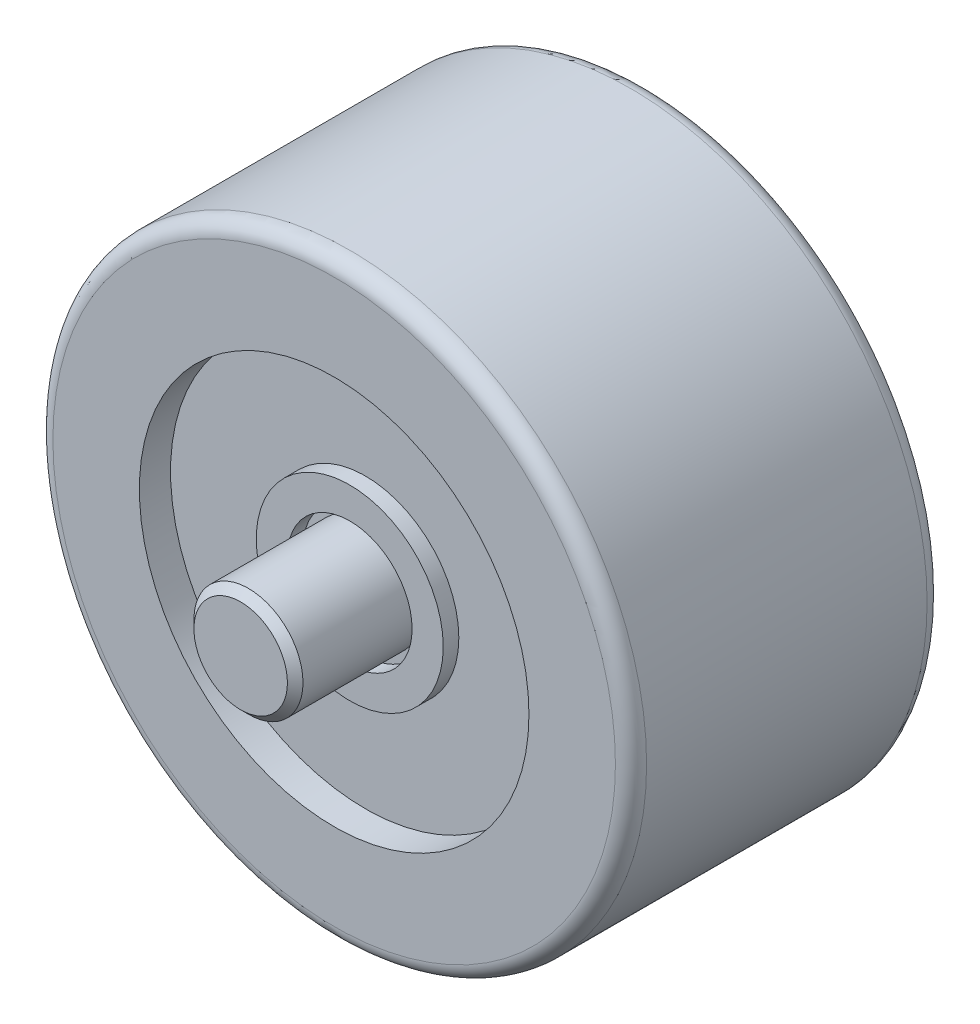
ISO-10303-21;
HEADER;
FILE_DESCRIPTION(('STEP AP214'),'2;1');
FILE_NAME('part.step','',(''),(''),'','','');
FILE_SCHEMA(('AUTOMOTIVE_DESIGN { 1 0 10303 214 1 1 1 1 }'));
ENDSEC;
DATA;
#1=APPLICATION_CONTEXT('core data for automotive mechanical design processes');
#2=APPLICATION_PROTOCOL_DEFINITION('international standard','automotive_design',2000,#1);
#3=PRODUCT_CONTEXT('',#1,'mechanical');
#4=PRODUCT('Part','Part','',(#3));
#5=PRODUCT_RELATED_PRODUCT_CATEGORY('part','',(#4));
#6=PRODUCT_DEFINITION_FORMATION('','',#4);
#7=PRODUCT_DEFINITION_CONTEXT('part definition',#1,'design');
#8=PRODUCT_DEFINITION('design','',#6,#7);
#9=PRODUCT_DEFINITION_SHAPE('','',#8);
#10=(LENGTH_UNIT() NAMED_UNIT(*) SI_UNIT(.MILLI.,.METRE.));
#11=(NAMED_UNIT(*) PLANE_ANGLE_UNIT() SI_UNIT($,.RADIAN.));
#12=(NAMED_UNIT(*) SI_UNIT($,.STERADIAN.) SOLID_ANGLE_UNIT());
#13=UNCERTAINTY_MEASURE_WITH_UNIT(LENGTH_MEASURE(1.E-05),#10,'distance_accuracy_value','');
#14=(GEOMETRIC_REPRESENTATION_CONTEXT(3) GLOBAL_UNCERTAINTY_ASSIGNED_CONTEXT((#13)) GLOBAL_UNIT_ASSIGNED_CONTEXT((#10,
#11,#12)) REPRESENTATION_CONTEXT('',''));
#15=CARTESIAN_POINT('',(0.,0.,0.));
#16=DIRECTION('',(0.,0.,1.));
#17=DIRECTION('',(1.,0.,0.));
#18=AXIS2_PLACEMENT_3D('',#15,#16,#17);
#19=CARTESIAN_POINT('',(0.,0.,8.));
#20=DIRECTION('',(0.,0.,1.));
#21=DIRECTION('',(1.,0.,0.));
#22=AXIS2_PLACEMENT_3D('',#19,#20,#21);
#23=PLANE('',#22);
#24=CARTESIAN_POINT('',(0.,0.,8.));
#25=DIRECTION('',(0.,0.,1.));
#26=DIRECTION('',(1.,0.,0.));
#27=AXIS2_PLACEMENT_3D('',#24,#25,#26);
#28=CIRCLE('',#27,4.);
#29=CARTESIAN_POINT('',(4.,0.,8.));
#30=VERTEX_POINT('',#29);
#31=EDGE_CURVE('E79',#30,#30,#28,.F.);
#32=ORIENTED_EDGE('',*,*,#31,.F.);
#33=EDGE_LOOP('',(#32));
#34=FACE_BOUND('',#33,.T.);
#35=CARTESIAN_POINT('',(0.,0.,8.));
#36=DIRECTION('',(0.,0.,1.));
#37=DIRECTION('',(1.,0.,0.));
#38=AXIS2_PLACEMENT_3D('',#35,#36,#37);
#39=CIRCLE('',#38,3.5);
#40=CARTESIAN_POINT('',(3.5,0.,8.));
#41=VERTEX_POINT('',#40);
#42=EDGE_CURVE('E137',#41,#41,#39,.T.);
#43=ORIENTED_EDGE('',*,*,#42,.F.);
#44=EDGE_LOOP('',(#43));
#45=FACE_BOUND('',#44,.T.);
#46=ADVANCED_FACE('F50',(#34,#45),#23,.T.);
#47=CARTESIAN_POINT('',(0.,0.,8.));
#48=DIRECTION('',(0.,0.,1.));
#49=DIRECTION('',(1.,0.,0.));
#50=AXIS2_PLACEMENT_3D('',#47,#48,#49);
#51=CIRCLE('',#50,12.5);
#52=CARTESIAN_POINT('',(12.5,0.,8.));
#53=VERTEX_POINT('',#52);
#54=EDGE_CURVE('E97',#53,#53,#51,.T.);
#55=ORIENTED_EDGE('',*,*,#54,.T.);
#56=EDGE_LOOP('',(#55));
#57=FACE_BOUND('',#56,.T.);
#58=CARTESIAN_POINT('',(0.,0.,8.));
#59=DIRECTION('',(0.,0.,1.));
#60=DIRECTION('',(1.,0.,0.));
#61=AXIS2_PLACEMENT_3D('',#58,#59,#60);
#62=CIRCLE('',#61,6.);
#63=CARTESIAN_POINT('',(6.,0.,8.));
#64=VERTEX_POINT('',#63);
#65=EDGE_CURVE('E118',#64,#64,#62,.T.);
#66=ORIENTED_EDGE('',*,*,#65,.F.);
#67=EDGE_LOOP('',(#66));
#68=FACE_BOUND('',#67,.T.);
#69=ADVANCED_FACE('F150',(#57,#68),#23,.T.);
#70=CARTESIAN_POINT('',(0.,0.,-10.));
#71=DIRECTION('',(0.,0.,1.));
#72=DIRECTION('',(1.,0.,0.));
#73=AXIS2_PLACEMENT_3D('',#70,#71,#72);
#74=CYLINDRICAL_SURFACE('',#73,19.05);
#75=CARTESIAN_POINT('',(0.,0.,-9.));
#76=DIRECTION('',(0.,0.,1.));
#77=DIRECTION('',(1.,0.,0.));
#78=AXIS2_PLACEMENT_3D('',#75,#76,#77);
#79=CIRCLE('',#78,19.05);
#80=CARTESIAN_POINT('',(19.05,0.,-9.));
#81=VERTEX_POINT('',#80);
#82=EDGE_CURVE('E93',#81,#81,#79,.T.);
#83=ORIENTED_EDGE('',*,*,#82,.T.);
#84=EDGE_LOOP('',(#83));
#85=FACE_BOUND('',#84,.T.);
#86=CARTESIAN_POINT('',(0.,0.,9.));
#87=DIRECTION('',(0.,0.,1.));
#88=DIRECTION('',(1.,0.,0.));
#89=AXIS2_PLACEMENT_3D('',#86,#87,#88);
#90=CIRCLE('',#89,19.05);
#91=CARTESIAN_POINT('',(19.05,0.,9.));
#92=VERTEX_POINT('',#91);
#93=EDGE_CURVE('E92',#92,#92,#90,.F.);
#94=ORIENTED_EDGE('',*,*,#93,.T.);
#95=EDGE_LOOP('',(#94));
#96=FACE_BOUND('',#95,.T.);
#97=ADVANCED_FACE('F154',(#85,#96),#74,.T.);
#98=CARTESIAN_POINT('',(0.,0.,-10.));
#99=DIRECTION('',(0.,0.,1.));
#100=DIRECTION('',(1.,0.,0.));
#101=AXIS2_PLACEMENT_3D('',#98,#99,#100);
#102=PLANE('',#101);
#103=CARTESIAN_POINT('',(0.,0.,-10.));
#104=DIRECTION('',(0.,0.,-1.));
#105=DIRECTION('',(-1.,0.,0.));
#106=AXIS2_PLACEMENT_3D('',#103,#104,#105);
#107=CIRCLE('',#106,12.5);
#108=CARTESIAN_POINT('',(-12.5,0.,-10.));
#109=VERTEX_POINT('',#108);
#110=EDGE_CURVE('E107',#109,#109,#107,.T.);
#111=ORIENTED_EDGE('',*,*,#110,.F.);
#112=EDGE_LOOP('',(#111));
#113=FACE_BOUND('',#112,.T.);
#114=CARTESIAN_POINT('',(0.,0.,-10.));
#115=DIRECTION('',(0.,0.,1.));
#116=DIRECTION('',(1.,0.,0.));
#117=AXIS2_PLACEMENT_3D('',#114,#115,#116);
#118=CIRCLE('',#117,18.05);
#119=CARTESIAN_POINT('',(18.05,0.,-10.));
#120=VERTEX_POINT('',#119);
#121=EDGE_CURVE('E87',#120,#120,#118,.F.);
#122=ORIENTED_EDGE('',*,*,#121,.T.);
#123=EDGE_LOOP('',(#122));
#124=FACE_BOUND('',#123,.T.);
#125=ADVANCED_FACE('F173',(#113,#124),#102,.F.);
#126=CARTESIAN_POINT('',(0.,0.,10.));
#127=DIRECTION('',(0.,0.,1.));
#128=DIRECTION('',(1.,0.,0.));
#129=AXIS2_PLACEMENT_3D('',#126,#127,#128);
#130=PLANE('',#129);
#131=CARTESIAN_POINT('',(0.,0.,10.));
#132=DIRECTION('',(0.,0.,1.));
#133=DIRECTION('',(1.,0.,0.));
#134=AXIS2_PLACEMENT_3D('',#131,#132,#133);
#135=CIRCLE('',#134,12.5);
#136=CARTESIAN_POINT('',(12.5,0.,10.));
#137=VERTEX_POINT('',#136);
#138=EDGE_CURVE('E99',#137,#137,#135,.T.);
#139=ORIENTED_EDGE('',*,*,#138,.F.);
#140=EDGE_LOOP('',(#139));
#141=FACE_BOUND('',#140,.T.);
#142=CARTESIAN_POINT('',(0.,0.,10.));
#143=DIRECTION('',(0.,0.,1.));
#144=DIRECTION('',(1.,0.,0.));
#145=AXIS2_PLACEMENT_3D('',#142,#143,#144);
#146=CIRCLE('',#145,18.05);
#147=CARTESIAN_POINT('',(18.05,0.,10.));
#148=VERTEX_POINT('',#147);
#149=EDGE_CURVE('E83',#148,#148,#146,.T.);
#150=ORIENTED_EDGE('',*,*,#149,.T.);
#151=EDGE_LOOP('',(#150));
#152=FACE_BOUND('',#151,.T.);
#153=ADVANCED_FACE('F170',(#141,#152),#130,.T.);
#154=CARTESIAN_POINT('',(0.,0.,-9.));
#155=DIRECTION('',(0.,0.,1.));
#156=DIRECTION('',(1.,0.,0.));
#157=AXIS2_PLACEMENT_3D('',#154,#155,#156);
#158=TOROIDAL_SURFACE('',#157,18.05,1.);
#159=ORIENTED_EDGE('',*,*,#121,.F.);
#160=EDGE_LOOP('',(#159));
#161=FACE_BOUND('',#160,.T.);
#162=ORIENTED_EDGE('',*,*,#82,.F.);
#163=EDGE_LOOP('',(#162));
#164=FACE_BOUND('',#163,.T.);
#165=ADVANCED_FACE('F168',(#161,#164),#158,.T.);
#166=CARTESIAN_POINT('',(0.,0.,9.));
#167=DIRECTION('',(0.,0.,1.));
#168=DIRECTION('',(1.,0.,0.));
#169=AXIS2_PLACEMENT_3D('',#166,#167,#168);
#170=TOROIDAL_SURFACE('',#169,18.05,1.);
#171=ORIENTED_EDGE('',*,*,#93,.F.);
#172=EDGE_LOOP('',(#171));
#173=FACE_BOUND('',#172,.T.);
#174=ORIENTED_EDGE('',*,*,#149,.F.);
#175=EDGE_LOOP('',(#174));
#176=FACE_BOUND('',#175,.T.);
#177=ADVANCED_FACE('F164',(#173,#176),#170,.T.);
#178=CARTESIAN_POINT('',(0.,0.,8.));
#179=DIRECTION('',(0.,0.,1.));
#180=DIRECTION('',(1.,0.,0.));
#181=AXIS2_PLACEMENT_3D('',#178,#179,#180);
#182=CYLINDRICAL_SURFACE('',#181,12.5);
#183=ORIENTED_EDGE('',*,*,#54,.F.);
#184=EDGE_LOOP('',(#183));
#185=FACE_BOUND('',#184,.T.);
#186=ORIENTED_EDGE('',*,*,#138,.T.);
#187=EDGE_LOOP('',(#186));
#188=FACE_BOUND('',#187,.T.);
#189=ADVANCED_FACE('F165',(#185,#188),#182,.F.);
#190=CARTESIAN_POINT('',(0.,0.,-8.));
#191=DIRECTION('',(0.,0.,-1.));
#192=DIRECTION('',(-1.,0.,0.));
#193=AXIS2_PLACEMENT_3D('',#190,#191,#192);
#194=CYLINDRICAL_SURFACE('',#193,12.5);
#195=CARTESIAN_POINT('',(0.,0.,-8.));
#196=DIRECTION('',(0.,0.,-1.));
#197=DIRECTION('',(-1.,0.,0.));
#198=AXIS2_PLACEMENT_3D('',#195,#196,#197);
#199=CIRCLE('',#198,12.5);
#200=CARTESIAN_POINT('',(-12.5,0.,-8.));
#201=VERTEX_POINT('',#200);
#202=EDGE_CURVE('E102',#201,#201,#199,.T.);
#203=ORIENTED_EDGE('',*,*,#202,.F.);
#204=EDGE_LOOP('',(#203));
#205=FACE_BOUND('',#204,.T.);
#206=ORIENTED_EDGE('',*,*,#110,.T.);
#207=EDGE_LOOP('',(#206));
#208=FACE_BOUND('',#207,.T.);
#209=ADVANCED_FACE('F159',(#205,#208),#194,.F.);
#210=CARTESIAN_POINT('',(0.,0.,-8.));
#211=DIRECTION('',(0.,0.,-1.));
#212=DIRECTION('',(-1.,0.,0.));
#213=AXIS2_PLACEMENT_3D('',#210,#211,#212);
#214=PLANE('',#213);
#215=CARTESIAN_POINT('',(0.,0.,-8.));
#216=DIRECTION('',(0.,0.,-1.));
#217=DIRECTION('',(-1.,0.,0.));
#218=AXIS2_PLACEMENT_3D('',#215,#216,#217);
#219=CIRCLE('',#218,6.);
#220=CARTESIAN_POINT('',(-6.,0.,-8.));
#221=VERTEX_POINT('',#220);
#222=EDGE_CURVE('E73',#221,#221,#219,.T.);
#223=ORIENTED_EDGE('',*,*,#222,.F.);
#224=EDGE_LOOP('',(#223));
#225=FACE_BOUND('',#224,.T.);
#226=ORIENTED_EDGE('',*,*,#202,.T.);
#227=EDGE_LOOP('',(#226));
#228=FACE_BOUND('',#227,.T.);
#229=ADVANCED_FACE('F207',(#225,#228),#214,.T.);
#230=CARTESIAN_POINT('',(0.,0.,9.));
#231=DIRECTION('',(0.,0.,1.));
#232=DIRECTION('',(1.,0.,0.));
#233=AXIS2_PLACEMENT_3D('',#230,#231,#232);
#234=PLANE('',#233);
#235=CARTESIAN_POINT('',(0.,0.,9.));
#236=DIRECTION('',(0.,0.,1.));
#237=DIRECTION('',(1.,0.,0.));
#238=AXIS2_PLACEMENT_3D('',#235,#236,#237);
#239=CIRCLE('',#238,6.);
#240=CARTESIAN_POINT('',(6.,0.,9.));
#241=VERTEX_POINT('',#240);
#242=EDGE_CURVE('E115',#241,#241,#239,.T.);
#243=ORIENTED_EDGE('',*,*,#242,.T.);
#244=EDGE_LOOP('',(#243));
#245=FACE_BOUND('',#244,.T.);
#246=CARTESIAN_POINT('',(0.,0.,9.));
#247=DIRECTION('',(0.,0.,1.));
#248=DIRECTION('',(1.,0.,0.));
#249=AXIS2_PLACEMENT_3D('',#246,#247,#248);
#250=CIRCLE('',#249,4.);
#251=CARTESIAN_POINT('',(4.,0.,9.));
#252=VERTEX_POINT('',#251);
#253=EDGE_CURVE('E117',#252,#252,#250,.T.);
#254=ORIENTED_EDGE('',*,*,#253,.F.);
#255=EDGE_LOOP('',(#254));
#256=FACE_BOUND('',#255,.T.);
#257=ADVANCED_FACE('F231',(#245,#256),#234,.T.);
#258=CARTESIAN_POINT('',(0.,0.,9.));
#259=DIRECTION('',(0.,0.,-1.));
#260=DIRECTION('',(-1.,0.,0.));
#261=AXIS2_PLACEMENT_3D('',#258,#259,#260);
#262=CYLINDRICAL_SURFACE('',#261,6.);
#263=ORIENTED_EDGE('',*,*,#242,.F.);
#264=EDGE_LOOP('',(#263));
#265=FACE_BOUND('',#264,.T.);
#266=ORIENTED_EDGE('',*,*,#65,.T.);
#267=EDGE_LOOP('',(#266));
#268=FACE_BOUND('',#267,.T.);
#269=ADVANCED_FACE('F233',(#265,#268),#262,.T.);
#270=CARTESIAN_POINT('',(0.,0.,9.));
#271=DIRECTION('',(0.,0.,-1.));
#272=DIRECTION('',(-1.,0.,0.));
#273=AXIS2_PLACEMENT_3D('',#270,#271,#272);
#274=CYLINDRICAL_SURFACE('',#273,4.);
#275=ORIENTED_EDGE('',*,*,#253,.T.);
#276=EDGE_LOOP('',(#275));
#277=FACE_BOUND('',#276,.T.);
#278=ORIENTED_EDGE('',*,*,#31,.T.);
#279=EDGE_LOOP('',(#278));
#280=FACE_BOUND('',#279,.T.);
#281=ADVANCED_FACE('F229',(#277,#280),#274,.F.);
#282=CARTESIAN_POINT('',(0.,0.,-9.));
#283=DIRECTION('',(0.,0.,1.));
#284=DIRECTION('',(1.,0.,0.));
#285=AXIS2_PLACEMENT_3D('',#282,#283,#284);
#286=CYLINDRICAL_SURFACE('',#285,6.);
#287=CARTESIAN_POINT('',(0.,0.,-9.));
#288=DIRECTION('',(0.,0.,1.));
#289=DIRECTION('',(1.,0.,0.));
#290=AXIS2_PLACEMENT_3D('',#287,#288,#289);
#291=CIRCLE('',#290,6.);
#292=CARTESIAN_POINT('',(6.,0.,-9.));
#293=VERTEX_POINT('',#292);
#294=EDGE_CURVE('E130',#293,#293,#291,.T.);
#295=ORIENTED_EDGE('',*,*,#294,.T.);
#296=EDGE_LOOP('',(#295));
#297=FACE_BOUND('',#296,.T.);
#298=ORIENTED_EDGE('',*,*,#222,.T.);
#299=EDGE_LOOP('',(#298));
#300=FACE_BOUND('',#299,.T.);
#301=ADVANCED_FACE('F219',(#297,#300),#286,.T.);
#302=CARTESIAN_POINT('',(0.,0.,-9.));
#303=DIRECTION('',(0.,0.,-1.));
#304=DIRECTION('',(1.,0.,0.));
#305=AXIS2_PLACEMENT_3D('',#302,#303,#304);
#306=PLANE('',#305);
#307=CARTESIAN_POINT('',(0.,0.,-9.));
#308=DIRECTION('',(0.,0.,1.));
#309=DIRECTION('',(1.,0.,0.));
#310=AXIS2_PLACEMENT_3D('',#307,#308,#309);
#311=CIRCLE('',#310,4.);
#312=CARTESIAN_POINT('',(4.,0.,-9.));
#313=VERTEX_POINT('',#312);
#314=EDGE_CURVE('E133',#313,#313,#311,.T.);
#315=ORIENTED_EDGE('',*,*,#314,.T.);
#316=EDGE_LOOP('',(#315));
#317=FACE_BOUND('',#316,.T.);
#318=ORIENTED_EDGE('',*,*,#294,.F.);
#319=EDGE_LOOP('',(#318));
#320=FACE_BOUND('',#319,.T.);
#321=ADVANCED_FACE('F213',(#317,#320),#306,.T.);
#322=CARTESIAN_POINT('',(0.,0.,-9.));
#323=DIRECTION('',(0.,0.,1.));
#324=DIRECTION('',(1.,0.,0.));
#325=AXIS2_PLACEMENT_3D('',#322,#323,#324);
#326=CYLINDRICAL_SURFACE('',#325,4.);
#327=ORIENTED_EDGE('',*,*,#314,.F.);
#328=EDGE_LOOP('',(#327));
#329=FACE_BOUND('',#328,.T.);
#330=CARTESIAN_POINT('',(0.,0.,-8.));
#331=DIRECTION('',(0.,0.,1.));
#332=DIRECTION('',(1.,0.,0.));
#333=AXIS2_PLACEMENT_3D('',#330,#331,#332);
#334=CIRCLE('',#333,4.);
#335=CARTESIAN_POINT('',(4.,0.,-8.));
#336=VERTEX_POINT('',#335);
#337=EDGE_CURVE('E135',#336,#336,#334,.T.);
#338=ORIENTED_EDGE('',*,*,#337,.T.);
#339=EDGE_LOOP('',(#338));
#340=FACE_BOUND('',#339,.T.);
#341=ADVANCED_FACE('F208',(#329,#340),#326,.F.);
#342=CARTESIAN_POINT('',(0.,0.,-8.));
#343=DIRECTION('',(0.,0.,-1.));
#344=DIRECTION('',(-1.,0.,0.));
#345=AXIS2_PLACEMENT_3D('',#342,#343,#344);
#346=CIRCLE('',#345,3.5);
#347=CARTESIAN_POINT('',(-3.5,0.,-8.));
#348=VERTEX_POINT('',#347);
#349=EDGE_CURVE('E72',#348,#348,#346,.T.);
#350=ORIENTED_EDGE('',*,*,#349,.F.);
#351=EDGE_LOOP('',(#350));
#352=FACE_BOUND('',#351,.T.);
#353=ORIENTED_EDGE('',*,*,#337,.F.);
#354=EDGE_LOOP('',(#353));
#355=FACE_BOUND('',#354,.T.);
#356=ADVANCED_FACE('F206',(#352,#355),#214,.T.);
#357=CARTESIAN_POINT('',(0.,0.,16.));
#358=DIRECTION('',(0.,0.,-1.));
#359=DIRECTION('',(-1.,0.,0.));
#360=AXIS2_PLACEMENT_3D('',#357,#358,#359);
#361=CYLINDRICAL_SURFACE('',#360,3.5);
#362=CARTESIAN_POINT('',(0.,0.,15.5));
#363=DIRECTION('',(0.,0.,1.));
#364=DIRECTION('',(1.,0.,0.));
#365=AXIS2_PLACEMENT_3D('',#362,#363,#364);
#366=CIRCLE('',#365,3.5);
#367=CARTESIAN_POINT('',(3.5,0.,15.5));
#368=VERTEX_POINT('',#367);
#369=EDGE_CURVE('E10',#368,#368,#366,.F.);
#370=ORIENTED_EDGE('',*,*,#369,.T.);
#371=EDGE_LOOP('',(#370));
#372=FACE_BOUND('',#371,.T.);
#373=ORIENTED_EDGE('',*,*,#42,.T.);
#374=EDGE_LOOP('',(#373));
#375=FACE_BOUND('',#374,.T.);
#376=ADVANCED_FACE('F145',(#372,#375),#361,.T.);
#377=CARTESIAN_POINT('',(0.,0.,16.));
#378=DIRECTION('',(0.,0.,1.));
#379=DIRECTION('',(1.,0.,0.));
#380=AXIS2_PLACEMENT_3D('',#377,#378,#379);
#381=PLANE('',#380);
#382=CARTESIAN_POINT('',(0.,0.,16.));
#383=DIRECTION('',(0.,0.,1.));
#384=DIRECTION('',(1.,0.,0.));
#385=AXIS2_PLACEMENT_3D('',#382,#383,#384);
#386=CIRCLE('',#385,3.00000000000002);
#387=CARTESIAN_POINT('',(3.00000000000002,0.,16.));
#388=VERTEX_POINT('',#387);
#389=EDGE_CURVE('E54',#388,#388,#386,.T.);
#390=ORIENTED_EDGE('',*,*,#389,.T.);
#391=EDGE_LOOP('',(#390));
#392=FACE_BOUND('',#391,.T.);
#393=ADVANCED_FACE('F205',(#392),#381,.T.);
#394=CARTESIAN_POINT('',(0.,0.,-16.));
#395=DIRECTION('',(0.,0.,1.));
#396=DIRECTION('',(1.,0.,0.));
#397=AXIS2_PLACEMENT_3D('',#394,#395,#396);
#398=CYLINDRICAL_SURFACE('',#397,3.5);
#399=CARTESIAN_POINT('',(0.,0.,-15.5));
#400=DIRECTION('',(0.,0.,-1.));
#401=DIRECTION('',(-1.,0.,0.));
#402=AXIS2_PLACEMENT_3D('',#399,#400,#401);
#403=CIRCLE('',#402,3.5);
#404=CARTESIAN_POINT('',(-3.5,0.,-15.5));
#405=VERTEX_POINT('',#404);
#406=EDGE_CURVE('E62',#405,#405,#403,.F.);
#407=ORIENTED_EDGE('',*,*,#406,.T.);
#408=EDGE_LOOP('',(#407));
#409=FACE_BOUND('',#408,.T.);
#410=ORIENTED_EDGE('',*,*,#349,.T.);
#411=EDGE_LOOP('',(#410));
#412=FACE_BOUND('',#411,.T.);
#413=ADVANCED_FACE('F193',(#409,#412),#398,.T.);
#414=CARTESIAN_POINT('',(0.,0.,-16.));
#415=DIRECTION('',(0.,0.,-1.));
#416=DIRECTION('',(1.,0.,0.));
#417=AXIS2_PLACEMENT_3D('',#414,#415,#416);
#418=PLANE('',#417);
#419=CARTESIAN_POINT('',(0.,0.,-16.));
#420=DIRECTION('',(0.,0.,-1.));
#421=DIRECTION('',(-1.,0.,0.));
#422=AXIS2_PLACEMENT_3D('',#419,#420,#421);
#423=CIRCLE('',#422,3.00000000000001);
#424=CARTESIAN_POINT('',(-3.00000000000001,0.,-16.));
#425=VERTEX_POINT('',#424);
#426=EDGE_CURVE('E58',#425,#425,#423,.T.);
#427=ORIENTED_EDGE('',*,*,#426,.T.);
#428=EDGE_LOOP('',(#427));
#429=FACE_BOUND('',#428,.T.);
#430=ADVANCED_FACE('F188',(#429),#418,.T.);
#431=CARTESIAN_POINT('',(0.,0.,-15.5));
#432=DIRECTION('',(0.,0.,1.));
#433=DIRECTION('',(1.,0.,0.));
#434=AXIS2_PLACEMENT_3D('',#431,#432,#433);
#435=CONICAL_SURFACE('',#434,3.5,0.785398163397449);
#436=ORIENTED_EDGE('',*,*,#426,.F.);
#437=EDGE_LOOP('',(#436));
#438=FACE_BOUND('',#437,.T.);
#439=ORIENTED_EDGE('',*,*,#406,.F.);
#440=EDGE_LOOP('',(#439));
#441=FACE_BOUND('',#440,.T.);
#442=ADVANCED_FACE('F184',(#438,#441),#435,.T.);
#443=CARTESIAN_POINT('',(0.,0.,16.));
#444=DIRECTION('',(0.,0.,-1.));
#445=DIRECTION('',(-1.,0.,0.));
#446=AXIS2_PLACEMENT_3D('',#443,#444,#445);
#447=CONICAL_SURFACE('',#446,3.00000000000002,0.785398163397444);
#448=ORIENTED_EDGE('',*,*,#369,.F.);
#449=EDGE_LOOP('',(#448));
#450=FACE_BOUND('',#449,.T.);
#451=ORIENTED_EDGE('',*,*,#389,.F.);
#452=EDGE_LOOP('',(#451));
#453=FACE_BOUND('',#452,.T.);
#454=ADVANCED_FACE('F47',(#450,#453),#447,.T.);
#455=CLOSED_SHELL('',(#46,#69,#97,#125,#153,#165,#177,#189,#209,#229,#257,#269,#281,#301,#321,
#341,#356,#376,#393,#413,#430,#442,#454));
#456=MANIFOLD_SOLID_BREP('B2',#455);
#457=ADVANCED_BREP_SHAPE_REPRESENTATION('',(#18,#456),#14);
#458=SHAPE_DEFINITION_REPRESENTATION(#9,#457);
ENDSEC;
END-ISO-10303-21;
